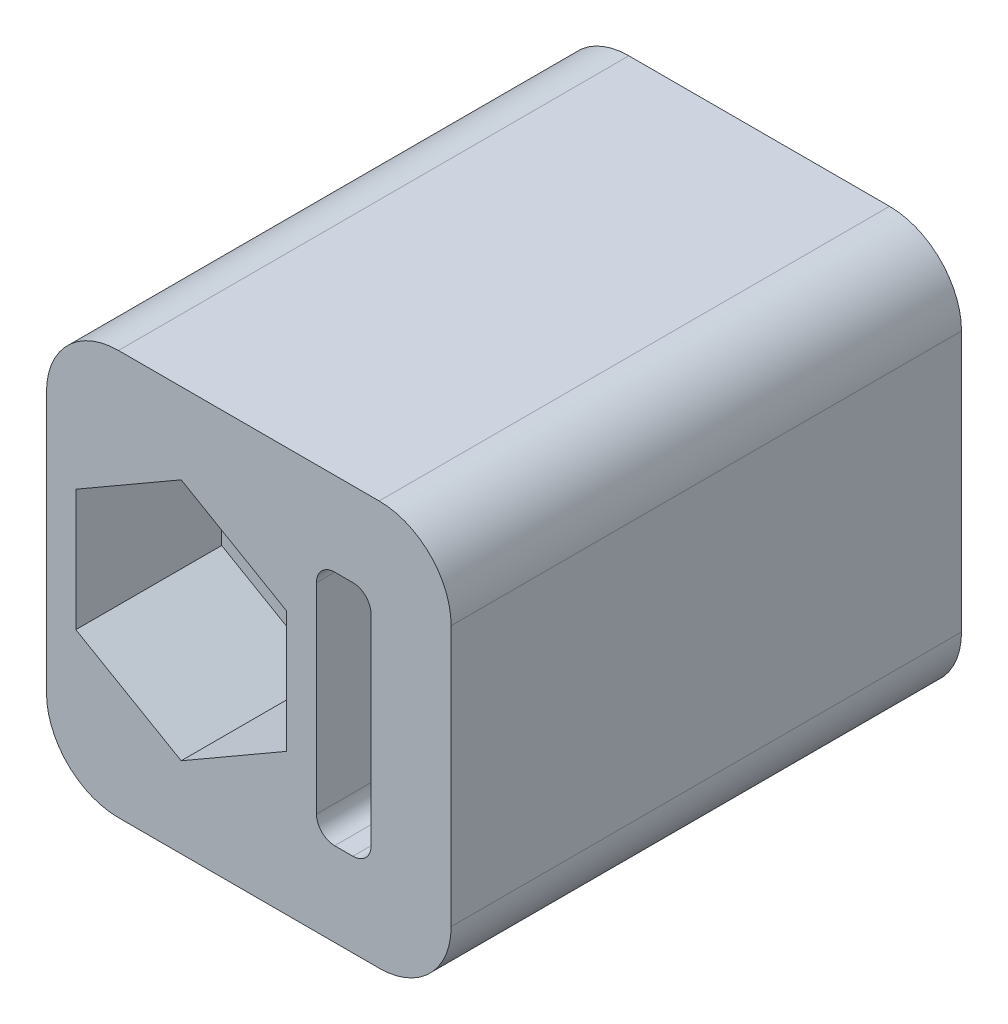
ISO-10303-21;
HEADER;
FILE_DESCRIPTION(('STEP AP214'),'2;1');
FILE_NAME('part.step','',(''),(''),'','','');
FILE_SCHEMA(('AUTOMOTIVE_DESIGN { 1 0 10303 214 1 1 1 1 }'));
ENDSEC;
DATA;
#1=APPLICATION_CONTEXT('core data for automotive mechanical design processes');
#2=APPLICATION_PROTOCOL_DEFINITION('international standard','automotive_design',2000,#1);
#3=PRODUCT_CONTEXT('',#1,'mechanical');
#4=PRODUCT('Part','Part','',(#3));
#5=PRODUCT_RELATED_PRODUCT_CATEGORY('part','',(#4));
#6=PRODUCT_DEFINITION_FORMATION('','',#4);
#7=PRODUCT_DEFINITION_CONTEXT('part definition',#1,'design');
#8=PRODUCT_DEFINITION('design','',#6,#7);
#9=PRODUCT_DEFINITION_SHAPE('','',#8);
#10=(LENGTH_UNIT() NAMED_UNIT(*) SI_UNIT(.MILLI.,.METRE.));
#11=(NAMED_UNIT(*) PLANE_ANGLE_UNIT() SI_UNIT($,.RADIAN.));
#12=(NAMED_UNIT(*) SI_UNIT($,.STERADIAN.) SOLID_ANGLE_UNIT());
#13=UNCERTAINTY_MEASURE_WITH_UNIT(LENGTH_MEASURE(1.E-05),#10,'distance_accuracy_value','');
#14=(GEOMETRIC_REPRESENTATION_CONTEXT(3) GLOBAL_UNCERTAINTY_ASSIGNED_CONTEXT((#13)) GLOBAL_UNIT_ASSIGNED_CONTEXT((#10,
#11,#12)) REPRESENTATION_CONTEXT('',''));
#15=CARTESIAN_POINT('',(0.,0.,0.));
#16=DIRECTION('',(0.,0.,1.));
#17=DIRECTION('',(1.,0.,0.));
#18=AXIS2_PLACEMENT_3D('',#15,#16,#17);
#19=CARTESIAN_POINT('',(-1.7200000000011,-3.5749999999999,0.));
#20=DIRECTION('',(0.,0.,1.));
#21=DIRECTION('',(1.,0.,0.));
#22=AXIS2_PLACEMENT_3D('',#19,#20,#21);
#23=PLANE('',#22);
#24=CARTESIAN_POINT('',(0.,0.,0.));
#25=DIRECTION('',(0.,0.,1.));
#26=DIRECTION('',(1.,0.,0.));
#27=AXIS2_PLACEMENT_3D('',#24,#25,#26);
#28=CIRCLE('',#27,1.70000000000001);
#29=CARTESIAN_POINT('',(1.70000000000001,0.,0.));
#30=VERTEX_POINT('',#29);
#31=EDGE_CURVE('E306',#30,#30,#28,.T.);
#32=ORIENTED_EDGE('',*,*,#31,.T.);
#33=EDGE_LOOP('',(#32));
#34=FACE_BOUND('',#33,.T.);
#35=CARTESIAN_POINT('',(-1.7200000000011,-3.5749999999999,0.));
#36=DIRECTION('',(0.,0.,1.));
#37=DIRECTION('',(1.,0.,0.));
#38=AXIS2_PLACEMENT_3D('',#35,#36,#37);
#39=CIRCLE('',#38,1.975);
#40=CARTESIAN_POINT('',(-3.6950000000011,-3.5749999999999,0.));
#41=VERTEX_POINT('',#40);
#42=CARTESIAN_POINT('',(-1.7200000000011,-5.5499999999999,0.));
#43=VERTEX_POINT('',#42);
#44=EDGE_CURVE('E358',#41,#43,#39,.T.);
#45=ORIENTED_EDGE('',*,*,#44,.F.);
#46=DIRECTION('',(0.,-1.,0.));
#47=VECTOR('',#46,1.);
#48=CARTESIAN_POINT('',(-3.6950000000011,-3.5749999999999,0.));
#49=LINE('',#48,#47);
#50=CARTESIAN_POINT('',(-3.6950000000011,3.5750000000001,0.));
#51=VERTEX_POINT('',#50);
#52=EDGE_CURVE('E363',#51,#41,#49,.T.);
#53=ORIENTED_EDGE('',*,*,#52,.F.);
#54=CARTESIAN_POINT('',(-1.7200000000011,3.5750000000001,0.));
#55=DIRECTION('',(0.,0.,1.));
#56=DIRECTION('',(1.,0.,0.));
#57=AXIS2_PLACEMENT_3D('',#54,#55,#56);
#58=CIRCLE('',#57,1.975);
#59=CARTESIAN_POINT('',(-1.7200000000011,5.5500000000001,0.));
#60=VERTEX_POINT('',#59);
#61=EDGE_CURVE('E390',#60,#51,#58,.T.);
#62=ORIENTED_EDGE('',*,*,#61,.F.);
#63=DIRECTION('',(-1.,0.,0.));
#64=VECTOR('',#63,1.);
#65=CARTESIAN_POINT('',(5.4299999999989,5.5500000000001,0.));
#66=LINE('',#65,#64);
#67=CARTESIAN_POINT('',(5.4299999999989,5.5500000000001,0.));
#68=VERTEX_POINT('',#67);
#69=EDGE_CURVE('E388',#68,#60,#66,.T.);
#70=ORIENTED_EDGE('',*,*,#69,.F.);
#71=CARTESIAN_POINT('',(5.4299999999989,3.5750000000001,0.));
#72=DIRECTION('',(0.,0.,1.));
#73=DIRECTION('',(1.,0.,0.));
#74=AXIS2_PLACEMENT_3D('',#71,#72,#73);
#75=CIRCLE('',#74,1.975);
#76=CARTESIAN_POINT('',(7.4049999999989,3.5750000000001,0.));
#77=VERTEX_POINT('',#76);
#78=EDGE_CURVE('E386',#77,#68,#75,.T.);
#79=ORIENTED_EDGE('',*,*,#78,.F.);
#80=DIRECTION('',(0.,1.,0.));
#81=VECTOR('',#80,1.);
#82=CARTESIAN_POINT('',(7.4049999999989,-3.5749999999999,0.));
#83=LINE('',#82,#81);
#84=CARTESIAN_POINT('',(7.4049999999989,-3.5749999999999,0.));
#85=VERTEX_POINT('',#84);
#86=EDGE_CURVE('E384',#85,#77,#83,.T.);
#87=ORIENTED_EDGE('',*,*,#86,.F.);
#88=CARTESIAN_POINT('',(5.4299999999989,-3.5749999999999,0.));
#89=DIRECTION('',(0.,0.,1.));
#90=DIRECTION('',(1.,0.,0.));
#91=AXIS2_PLACEMENT_3D('',#88,#89,#90);
#92=CIRCLE('',#91,1.975);
#93=CARTESIAN_POINT('',(5.4299999999989,-5.5499999999999,0.));
#94=VERTEX_POINT('',#93);
#95=EDGE_CURVE('E382',#94,#85,#92,.T.);
#96=ORIENTED_EDGE('',*,*,#95,.F.);
#97=DIRECTION('',(1.,0.,0.));
#98=VECTOR('',#97,1.);
#99=CARTESIAN_POINT('',(5.4299999999989,-5.5499999999999,0.));
#100=LINE('',#99,#98);
#101=EDGE_CURVE('E380',#43,#94,#100,.T.);
#102=ORIENTED_EDGE('',*,*,#101,.F.);
#103=EDGE_LOOP('',(#45,#53,#62,#70,#79,#87,#96,#102));
#104=FACE_BOUND('',#103,.T.);
#105=DIRECTION('',(1.,0.,0.));
#106=VECTOR('',#105,1.);
#107=CARTESIAN_POINT('',(4.21000000000005,-3.25000000000034,0.));
#108=LINE('',#107,#106);
#109=CARTESIAN_POINT('',(4.21000000000005,-3.25000000000034,0.));
#110=VERTEX_POINT('',#109);
#111=CARTESIAN_POINT('',(5.51000000000004,-3.25000000000034,0.));
#112=VERTEX_POINT('',#111);
#113=EDGE_CURVE('E313',#110,#112,#108,.T.);
#114=ORIENTED_EDGE('',*,*,#113,.T.);
#115=CARTESIAN_POINT('',(5.51000000000004,-2.75000000000034,0.));
#116=DIRECTION('',(0.,0.,1.));
#117=DIRECTION('',(1.,0.,0.));
#118=AXIS2_PLACEMENT_3D('',#115,#116,#117);
#119=CIRCLE('',#118,0.500000000000007);
#120=CARTESIAN_POINT('',(6.01000000000005,-2.75000000000034,0.));
#121=VERTEX_POINT('',#120);
#122=EDGE_CURVE('E228',#112,#121,#119,.T.);
#123=ORIENTED_EDGE('',*,*,#122,.T.);
#124=DIRECTION('',(0.,1.,0.));
#125=VECTOR('',#124,1.);
#126=CARTESIAN_POINT('',(6.01000000000006,2.74999999999966,0.));
#127=LINE('',#126,#125);
#128=CARTESIAN_POINT('',(6.01000000000006,2.74999999999966,0.));
#129=VERTEX_POINT('',#128);
#130=EDGE_CURVE('E246',#121,#129,#127,.T.);
#131=ORIENTED_EDGE('',*,*,#130,.T.);
#132=CARTESIAN_POINT('',(5.51000000000004,2.74999999999966,0.));
#133=DIRECTION('',(0.,0.,1.));
#134=DIRECTION('',(1.,0.,0.));
#135=AXIS2_PLACEMENT_3D('',#132,#133,#134);
#136=CIRCLE('',#135,0.500000000000011);
#137=CARTESIAN_POINT('',(5.51000000000004,3.24999999999967,0.));
#138=VERTEX_POINT('',#137);
#139=EDGE_CURVE('E222',#129,#138,#136,.T.);
#140=ORIENTED_EDGE('',*,*,#139,.T.);
#141=DIRECTION('',(-1.,0.,0.));
#142=VECTOR('',#141,1.);
#143=CARTESIAN_POINT('',(4.21000000000005,3.24999999999966,0.));
#144=LINE('',#143,#142);
#145=CARTESIAN_POINT('',(4.21000000000005,3.24999999999966,0.));
#146=VERTEX_POINT('',#145);
#147=EDGE_CURVE('E309',#138,#146,#144,.T.);
#148=ORIENTED_EDGE('',*,*,#147,.T.);
#149=CARTESIAN_POINT('',(4.21000000000005,2.74999999999966,0.));
#150=DIRECTION('',(0.,0.,1.));
#151=DIRECTION('',(-1.,0.,0.));
#152=AXIS2_PLACEMENT_3D('',#149,#150,#151);
#153=CIRCLE('',#152,0.5);
#154=CARTESIAN_POINT('',(3.71000000000004,2.74999999999966,0.));
#155=VERTEX_POINT('',#154);
#156=EDGE_CURVE('E330',#146,#155,#153,.T.);
#157=ORIENTED_EDGE('',*,*,#156,.T.);
#158=DIRECTION('',(0.,-1.,0.));
#159=VECTOR('',#158,1.);
#160=CARTESIAN_POINT('',(3.71000000000004,2.74999999999966,0.));
#161=LINE('',#160,#159);
#162=CARTESIAN_POINT('',(3.71000000000004,-2.75000000000034,0.));
#163=VERTEX_POINT('',#162);
#164=EDGE_CURVE('E333',#155,#163,#161,.T.);
#165=ORIENTED_EDGE('',*,*,#164,.T.);
#166=CARTESIAN_POINT('',(4.21000000000005,-2.75000000000034,0.));
#167=DIRECTION('',(0.,0.,1.));
#168=DIRECTION('',(1.,0.,0.));
#169=AXIS2_PLACEMENT_3D('',#166,#167,#168);
#170=CIRCLE('',#169,0.5);
#171=EDGE_CURVE('E336',#163,#110,#170,.T.);
#172=ORIENTED_EDGE('',*,*,#171,.T.);
#173=EDGE_LOOP('',(#114,#123,#131,#140,#148,#157,#165,#172));
#174=FACE_BOUND('',#173,.T.);
#175=ADVANCED_FACE('F37',(#34,#104,#174),#23,.F.);
#176=CARTESIAN_POINT('',(0.,0.,14.));
#177=DIRECTION('',(0.,0.,-1.));
#178=DIRECTION('',(-1.,0.,0.));
#179=AXIS2_PLACEMENT_3D('',#176,#177,#178);
#180=CYLINDRICAL_SURFACE('',#179,1.70000000000001);
#181=ORIENTED_EDGE('',*,*,#31,.F.);
#182=EDGE_LOOP('',(#181));
#183=FACE_BOUND('',#182,.T.);
#184=CARTESIAN_POINT('',(0.,0.,10.));
#185=DIRECTION('',(0.,0.,1.));
#186=DIRECTION('',(1.,0.,0.));
#187=AXIS2_PLACEMENT_3D('',#184,#185,#186);
#188=CIRCLE('',#187,1.70000000000001);
#189=CARTESIAN_POINT('',(1.70000000000001,0.,10.));
#190=VERTEX_POINT('',#189);
#191=EDGE_CURVE('E41',#190,#190,#188,.T.);
#192=ORIENTED_EDGE('',*,*,#191,.T.);
#193=EDGE_LOOP('',(#192));
#194=FACE_BOUND('',#193,.T.);
#195=ADVANCED_FACE('F461',(#183,#194),#180,.F.);
#196=CARTESIAN_POINT('',(-1.7200000000011,-3.5749999999999,14.));
#197=DIRECTION('',(0.,0.,1.));
#198=DIRECTION('',(1.,0.,0.));
#199=AXIS2_PLACEMENT_3D('',#196,#197,#198);
#200=PLANE('',#199);
#201=DIRECTION('',(-0.866025403784439,0.5,0.));
#202=VECTOR('',#201,1.);
#203=CARTESIAN_POINT('',(2.89,1.66854227795802,14.));
#204=LINE('',#203,#202);
#205=CARTESIAN_POINT('',(2.89,1.66854227795802,14.));
#206=VERTEX_POINT('',#205);
#207=CARTESIAN_POINT('',(0.,3.33708455591604,14.));
#208=VERTEX_POINT('',#207);
#209=EDGE_CURVE('E61',#206,#208,#204,.T.);
#210=ORIENTED_EDGE('',*,*,#209,.F.);
#211=DIRECTION('',(0.,1.,0.));
#212=VECTOR('',#211,1.);
#213=CARTESIAN_POINT('',(2.89,-1.66854227795802,14.));
#214=LINE('',#213,#212);
#215=CARTESIAN_POINT('',(2.89,-1.66854227795802,14.));
#216=VERTEX_POINT('',#215);
#217=EDGE_CURVE('E264',#216,#206,#214,.T.);
#218=ORIENTED_EDGE('',*,*,#217,.F.);
#219=DIRECTION('',(0.866025403784439,0.5,0.));
#220=VECTOR('',#219,1.);
#221=CARTESIAN_POINT('',(0.,-3.33708455591604,14.));
#222=LINE('',#221,#220);
#223=CARTESIAN_POINT('',(0.,-3.33708455591604,14.));
#224=VERTEX_POINT('',#223);
#225=EDGE_CURVE('E290',#224,#216,#222,.T.);
#226=ORIENTED_EDGE('',*,*,#225,.F.);
#227=DIRECTION('',(0.866025403784438,-0.5,0.));
#228=VECTOR('',#227,1.);
#229=CARTESIAN_POINT('',(-2.89,-1.66854227795802,14.));
#230=LINE('',#229,#228);
#231=CARTESIAN_POINT('',(-2.89,-1.66854227795802,14.));
#232=VERTEX_POINT('',#231);
#233=EDGE_CURVE('E287',#232,#224,#230,.T.);
#234=ORIENTED_EDGE('',*,*,#233,.F.);
#235=DIRECTION('',(0.,-1.,0.));
#236=VECTOR('',#235,1.);
#237=CARTESIAN_POINT('',(-2.89,1.66854227795802,14.));
#238=LINE('',#237,#236);
#239=CARTESIAN_POINT('',(-2.89,1.66854227795802,14.));
#240=VERTEX_POINT('',#239);
#241=EDGE_CURVE('E284',#240,#232,#238,.T.);
#242=ORIENTED_EDGE('',*,*,#241,.F.);
#243=DIRECTION('',(-0.866025403784439,-0.5,0.));
#244=VECTOR('',#243,1.);
#245=CARTESIAN_POINT('',(0.,3.33708455591604,14.));
#246=LINE('',#245,#244);
#247=EDGE_CURVE('E281',#208,#240,#246,.T.);
#248=ORIENTED_EDGE('',*,*,#247,.F.);
#249=EDGE_LOOP('',(#210,#218,#226,#234,#242,#248));
#250=FACE_BOUND('',#249,.T.);
#251=DIRECTION('',(0.,1.,0.));
#252=VECTOR('',#251,1.);
#253=CARTESIAN_POINT('',(5.2099999999998,2.74999999999904,14.));
#254=LINE('',#253,#252);
#255=CARTESIAN_POINT('',(5.2099999999998,-2.75000000000096,14.));
#256=VERTEX_POINT('',#255);
#257=CARTESIAN_POINT('',(5.2099999999998,2.74999999999904,14.));
#258=VERTEX_POINT('',#257);
#259=EDGE_CURVE('E312',#256,#258,#254,.T.);
#260=ORIENTED_EDGE('',*,*,#259,.F.);
#261=CARTESIAN_POINT('',(4.7099999999998,-2.75000000000034,14.));
#262=DIRECTION('',(0.,0.,1.));
#263=DIRECTION('',(-1.,0.,0.));
#264=AXIS2_PLACEMENT_3D('',#261,#262,#263);
#265=CIRCLE('',#264,0.5);
#266=CARTESIAN_POINT('',(4.71000000000005,-3.25000000000034,14.));
#267=VERTEX_POINT('',#266);
#268=EDGE_CURVE('E310',#267,#256,#265,.T.);
#269=ORIENTED_EDGE('',*,*,#268,.F.);
#270=DIRECTION('',(1.,0.,0.));
#271=VECTOR('',#270,1.);
#272=CARTESIAN_POINT('',(4.21000000000005,-3.25000000000034,14.));
#273=LINE('',#272,#271);
#274=CARTESIAN_POINT('',(4.21000000000005,-3.25000000000034,14.));
#275=VERTEX_POINT('',#274);
#276=EDGE_CURVE('E326',#275,#267,#273,.T.);
#277=ORIENTED_EDGE('',*,*,#276,.F.);
#278=CARTESIAN_POINT('',(4.21000000000005,-2.75000000000034,14.));
#279=DIRECTION('',(0.,0.,1.));
#280=DIRECTION('',(1.,0.,0.));
#281=AXIS2_PLACEMENT_3D('',#278,#279,#280);
#282=CIRCLE('',#281,0.5);
#283=CARTESIAN_POINT('',(3.71000000000004,-2.75000000000034,14.));
#284=VERTEX_POINT('',#283);
#285=EDGE_CURVE('E323',#284,#275,#282,.T.);
#286=ORIENTED_EDGE('',*,*,#285,.F.);
#287=DIRECTION('',(0.,-1.,0.));
#288=VECTOR('',#287,1.);
#289=CARTESIAN_POINT('',(3.71000000000004,2.74999999999966,14.));
#290=LINE('',#289,#288);
#291=CARTESIAN_POINT('',(3.71000000000004,2.74999999999966,14.));
#292=VERTEX_POINT('',#291);
#293=EDGE_CURVE('E321',#292,#284,#290,.T.);
#294=ORIENTED_EDGE('',*,*,#293,.F.);
#295=CARTESIAN_POINT('',(4.21000000000005,2.74999999999966,14.));
#296=DIRECTION('',(0.,0.,1.));
#297=DIRECTION('',(-1.,0.,0.));
#298=AXIS2_PLACEMENT_3D('',#295,#296,#297);
#299=CIRCLE('',#298,0.5);
#300=CARTESIAN_POINT('',(4.21000000000005,3.24999999999966,14.));
#301=VERTEX_POINT('',#300);
#302=EDGE_CURVE('E319',#301,#292,#299,.T.);
#303=ORIENTED_EDGE('',*,*,#302,.F.);
#304=DIRECTION('',(-1.,0.,0.));
#305=VECTOR('',#304,1.);
#306=CARTESIAN_POINT('',(4.21000000000005,3.24999999999966,14.));
#307=LINE('',#306,#305);
#308=CARTESIAN_POINT('',(4.71000000000005,3.24999999999966,14.));
#309=VERTEX_POINT('',#308);
#310=EDGE_CURVE('E317',#309,#301,#307,.T.);
#311=ORIENTED_EDGE('',*,*,#310,.F.);
#312=CARTESIAN_POINT('',(4.7099999999998,2.74999999999966,14.));
#313=DIRECTION('',(0.,0.,1.));
#314=DIRECTION('',(-1.,0.,0.));
#315=AXIS2_PLACEMENT_3D('',#312,#313,#314);
#316=CIRCLE('',#315,0.499999999999999);
#317=EDGE_CURVE('E315',#258,#309,#316,.T.);
#318=ORIENTED_EDGE('',*,*,#317,.F.);
#319=EDGE_LOOP('',(#260,#269,#277,#286,#294,#303,#311,#318));
#320=FACE_BOUND('',#319,.T.);
#321=CARTESIAN_POINT('',(-1.7200000000011,-3.5749999999999,14.));
#322=DIRECTION('',(0.,0.,1.));
#323=DIRECTION('',(1.,0.,0.));
#324=AXIS2_PLACEMENT_3D('',#321,#322,#323);
#325=CIRCLE('',#324,1.975);
#326=CARTESIAN_POINT('',(-3.6950000000011,-3.5749999999999,14.));
#327=VERTEX_POINT('',#326);
#328=CARTESIAN_POINT('',(-1.7200000000011,-5.5499999999999,14.));
#329=VERTEX_POINT('',#328);
#330=EDGE_CURVE('E359',#327,#329,#325,.T.);
#331=ORIENTED_EDGE('',*,*,#330,.T.);
#332=DIRECTION('',(1.,0.,0.));
#333=VECTOR('',#332,1.);
#334=CARTESIAN_POINT('',(5.4299999999989,-5.5499999999999,14.));
#335=LINE('',#334,#333);
#336=CARTESIAN_POINT('',(5.4299999999989,-5.5499999999999,14.));
#337=VERTEX_POINT('',#336);
#338=EDGE_CURVE('E362',#329,#337,#335,.T.);
#339=ORIENTED_EDGE('',*,*,#338,.T.);
#340=CARTESIAN_POINT('',(5.4299999999989,-3.5749999999999,14.));
#341=DIRECTION('',(0.,0.,1.));
#342=DIRECTION('',(1.,0.,0.));
#343=AXIS2_PLACEMENT_3D('',#340,#341,#342);
#344=CIRCLE('',#343,1.975);
#345=CARTESIAN_POINT('',(7.4049999999989,-3.5749999999999,14.));
#346=VERTEX_POINT('',#345);
#347=EDGE_CURVE('E365',#337,#346,#344,.T.);
#348=ORIENTED_EDGE('',*,*,#347,.T.);
#349=DIRECTION('',(0.,1.,0.));
#350=VECTOR('',#349,1.);
#351=CARTESIAN_POINT('',(7.4049999999989,-3.5749999999999,14.));
#352=LINE('',#351,#350);
#353=CARTESIAN_POINT('',(7.4049999999989,3.5750000000001,14.));
#354=VERTEX_POINT('',#353);
#355=EDGE_CURVE('E367',#346,#354,#352,.T.);
#356=ORIENTED_EDGE('',*,*,#355,.T.);
#357=CARTESIAN_POINT('',(5.4299999999989,3.5750000000001,14.));
#358=DIRECTION('',(0.,0.,1.));
#359=DIRECTION('',(1.,0.,0.));
#360=AXIS2_PLACEMENT_3D('',#357,#358,#359);
#361=CIRCLE('',#360,1.975);
#362=CARTESIAN_POINT('',(5.4299999999989,5.5500000000001,14.));
#363=VERTEX_POINT('',#362);
#364=EDGE_CURVE('E369',#354,#363,#361,.T.);
#365=ORIENTED_EDGE('',*,*,#364,.T.);
#366=DIRECTION('',(-1.,0.,0.));
#367=VECTOR('',#366,1.);
#368=CARTESIAN_POINT('',(5.4299999999989,5.5500000000001,14.));
#369=LINE('',#368,#367);
#370=CARTESIAN_POINT('',(-1.7200000000011,5.5500000000001,14.));
#371=VERTEX_POINT('',#370);
#372=EDGE_CURVE('E371',#363,#371,#369,.T.);
#373=ORIENTED_EDGE('',*,*,#372,.T.);
#374=CARTESIAN_POINT('',(-1.7200000000011,3.5750000000001,14.));
#375=DIRECTION('',(0.,0.,1.));
#376=DIRECTION('',(1.,0.,0.));
#377=AXIS2_PLACEMENT_3D('',#374,#375,#376);
#378=CIRCLE('',#377,1.975);
#379=CARTESIAN_POINT('',(-3.6950000000011,3.5750000000001,14.));
#380=VERTEX_POINT('',#379);
#381=EDGE_CURVE('E373',#371,#380,#378,.T.);
#382=ORIENTED_EDGE('',*,*,#381,.T.);
#383=DIRECTION('',(0.,-1.,0.));
#384=VECTOR('',#383,1.);
#385=CARTESIAN_POINT('',(-3.6950000000011,-3.5749999999999,14.));
#386=LINE('',#385,#384);
#387=EDGE_CURVE('E375',#380,#327,#386,.T.);
#388=ORIENTED_EDGE('',*,*,#387,.T.);
#389=EDGE_LOOP('',(#331,#339,#348,#356,#365,#373,#382,#388));
#390=FACE_BOUND('',#389,.T.);
#391=ADVANCED_FACE('F434',(#250,#320,#390),#200,.T.);
#392=CARTESIAN_POINT('',(-1.7200000000011,-3.5749999999999,14.));
#393=DIRECTION('',(0.,0.,-1.));
#394=DIRECTION('',(-1.,0.,0.));
#395=AXIS2_PLACEMENT_3D('',#392,#393,#394);
#396=CYLINDRICAL_SURFACE('',#395,1.975);
#397=ORIENTED_EDGE('',*,*,#44,.T.);
#398=DIRECTION('',(0.,0.,-1.));
#399=VECTOR('',#398,1.);
#400=CARTESIAN_POINT('',(-1.7200000000011,-5.5499999999999,14.));
#401=LINE('',#400,#399);
#402=EDGE_CURVE('E11',#329,#43,#401,.T.);
#403=ORIENTED_EDGE('',*,*,#402,.F.);
#404=ORIENTED_EDGE('',*,*,#330,.F.);
#405=DIRECTION('',(0.,0.,-1.));
#406=VECTOR('',#405,1.);
#407=CARTESIAN_POINT('',(-3.6950000000011,-3.5749999999999,14.));
#408=LINE('',#407,#406);
#409=EDGE_CURVE('E377',#327,#41,#408,.T.);
#410=ORIENTED_EDGE('',*,*,#409,.T.);
#411=EDGE_LOOP('',(#397,#403,#404,#410));
#412=FACE_BOUND('',#411,.T.);
#413=ADVANCED_FACE('F39',(#412),#396,.T.);
#414=CARTESIAN_POINT('',(5.4299999999989,-5.5499999999999,14.));
#415=DIRECTION('',(0.,1.,0.));
#416=DIRECTION('',(0.,0.,1.));
#417=AXIS2_PLACEMENT_3D('',#414,#415,#416);
#418=PLANE('',#417);
#419=ORIENTED_EDGE('',*,*,#101,.T.);
#420=DIRECTION('',(0.,0.,-1.));
#421=VECTOR('',#420,1.);
#422=CARTESIAN_POINT('',(5.4299999999989,-5.5499999999999,14.));
#423=LINE('',#422,#421);
#424=EDGE_CURVE('E46',#337,#94,#423,.T.);
#425=ORIENTED_EDGE('',*,*,#424,.F.);
#426=ORIENTED_EDGE('',*,*,#338,.F.);
#427=ORIENTED_EDGE('',*,*,#402,.T.);
#428=EDGE_LOOP('',(#419,#425,#426,#427));
#429=FACE_BOUND('',#428,.T.);
#430=ADVANCED_FACE('F438',(#429),#418,.F.);
#431=CARTESIAN_POINT('',(5.4299999999989,-3.5749999999999,14.));
#432=DIRECTION('',(0.,0.,-1.));
#433=DIRECTION('',(-1.,0.,0.));
#434=AXIS2_PLACEMENT_3D('',#431,#432,#433);
#435=CYLINDRICAL_SURFACE('',#434,1.975);
#436=ORIENTED_EDGE('',*,*,#95,.T.);
#437=DIRECTION('',(0.,0.,-1.));
#438=VECTOR('',#437,1.);
#439=CARTESIAN_POINT('',(7.4049999999989,-3.5749999999999,14.));
#440=LINE('',#439,#438);
#441=EDGE_CURVE('E407',#346,#85,#440,.T.);
#442=ORIENTED_EDGE('',*,*,#441,.F.);
#443=ORIENTED_EDGE('',*,*,#347,.F.);
#444=ORIENTED_EDGE('',*,*,#424,.T.);
#445=EDGE_LOOP('',(#436,#442,#443,#444));
#446=FACE_BOUND('',#445,.T.);
#447=ADVANCED_FACE('F415',(#446),#435,.T.);
#448=CARTESIAN_POINT('',(7.4049999999989,-3.5749999999999,14.));
#449=DIRECTION('',(-1.,0.,0.));
#450=DIRECTION('',(0.,0.,1.));
#451=AXIS2_PLACEMENT_3D('',#448,#449,#450);
#452=PLANE('',#451);
#453=ORIENTED_EDGE('',*,*,#86,.T.);
#454=DIRECTION('',(0.,0.,-1.));
#455=VECTOR('',#454,1.);
#456=CARTESIAN_POINT('',(7.4049999999989,3.5750000000001,14.));
#457=LINE('',#456,#455);
#458=EDGE_CURVE('E404',#354,#77,#457,.T.);
#459=ORIENTED_EDGE('',*,*,#458,.F.);
#460=ORIENTED_EDGE('',*,*,#355,.F.);
#461=ORIENTED_EDGE('',*,*,#441,.T.);
#462=EDGE_LOOP('',(#453,#459,#460,#461));
#463=FACE_BOUND('',#462,.T.);
#464=ADVANCED_FACE('F426',(#463),#452,.F.);
#465=CARTESIAN_POINT('',(5.4299999999989,3.5750000000001,14.));
#466=DIRECTION('',(0.,0.,-1.));
#467=DIRECTION('',(-1.,0.,0.));
#468=AXIS2_PLACEMENT_3D('',#465,#466,#467);
#469=CYLINDRICAL_SURFACE('',#468,1.975);
#470=ORIENTED_EDGE('',*,*,#78,.T.);
#471=DIRECTION('',(0.,0.,-1.));
#472=VECTOR('',#471,1.);
#473=CARTESIAN_POINT('',(5.4299999999989,5.5500000000001,14.));
#474=LINE('',#473,#472);
#475=EDGE_CURVE('E401',#363,#68,#474,.T.);
#476=ORIENTED_EDGE('',*,*,#475,.F.);
#477=ORIENTED_EDGE('',*,*,#364,.F.);
#478=ORIENTED_EDGE('',*,*,#458,.T.);
#479=EDGE_LOOP('',(#470,#476,#477,#478));
#480=FACE_BOUND('',#479,.T.);
#481=ADVANCED_FACE('F430',(#480),#469,.T.);
#482=CARTESIAN_POINT('',(5.4299999999989,5.5500000000001,14.));
#483=DIRECTION('',(0.,-1.,0.));
#484=DIRECTION('',(0.,0.,-1.));
#485=AXIS2_PLACEMENT_3D('',#482,#483,#484);
#486=PLANE('',#485);
#487=ORIENTED_EDGE('',*,*,#69,.T.);
#488=DIRECTION('',(0.,0.,-1.));
#489=VECTOR('',#488,1.);
#490=CARTESIAN_POINT('',(-1.7200000000011,5.5500000000001,14.));
#491=LINE('',#490,#489);
#492=EDGE_CURVE('E398',#371,#60,#491,.T.);
#493=ORIENTED_EDGE('',*,*,#492,.F.);
#494=ORIENTED_EDGE('',*,*,#372,.F.);
#495=ORIENTED_EDGE('',*,*,#475,.T.);
#496=EDGE_LOOP('',(#487,#493,#494,#495));
#497=FACE_BOUND('',#496,.T.);
#498=ADVANCED_FACE('F451',(#497),#486,.F.);
#499=CARTESIAN_POINT('',(-1.7200000000011,3.5750000000001,14.));
#500=DIRECTION('',(0.,0.,-1.));
#501=DIRECTION('',(-1.,0.,0.));
#502=AXIS2_PLACEMENT_3D('',#499,#500,#501);
#503=CYLINDRICAL_SURFACE('',#502,1.975);
#504=ORIENTED_EDGE('',*,*,#61,.T.);
#505=DIRECTION('',(0.,0.,-1.));
#506=VECTOR('',#505,1.);
#507=CARTESIAN_POINT('',(-3.6950000000011,3.5750000000001,14.));
#508=LINE('',#507,#506);
#509=EDGE_CURVE('E395',#380,#51,#508,.T.);
#510=ORIENTED_EDGE('',*,*,#509,.F.);
#511=ORIENTED_EDGE('',*,*,#381,.F.);
#512=ORIENTED_EDGE('',*,*,#492,.T.);
#513=EDGE_LOOP('',(#504,#510,#511,#512));
#514=FACE_BOUND('',#513,.T.);
#515=ADVANCED_FACE('F449',(#514),#503,.T.);
#516=CARTESIAN_POINT('',(-3.6950000000011,-3.5749999999999,14.));
#517=DIRECTION('',(1.,0.,0.));
#518=DIRECTION('',(0.,0.,-1.));
#519=AXIS2_PLACEMENT_3D('',#516,#517,#518);
#520=PLANE('',#519);
#521=ORIENTED_EDGE('',*,*,#52,.T.);
#522=ORIENTED_EDGE('',*,*,#409,.F.);
#523=ORIENTED_EDGE('',*,*,#387,.F.);
#524=ORIENTED_EDGE('',*,*,#509,.T.);
#525=EDGE_LOOP('',(#521,#522,#523,#524));
#526=FACE_BOUND('',#525,.T.);
#527=ADVANCED_FACE('F444',(#526),#520,.F.);
#528=CARTESIAN_POINT('',(4.7099999999998,-2.75000000000034,14.));
#529=DIRECTION('',(0.,0.,-1.));
#530=DIRECTION('',(-1.,0.,0.));
#531=AXIS2_PLACEMENT_3D('',#528,#529,#530);
#532=CYLINDRICAL_SURFACE('',#531,0.5);
#533=CARTESIAN_POINT('',(4.7099999999998,-2.75000000000034,7.));
#534=DIRECTION('',(0.,0.,1.));
#535=DIRECTION('',(1.,0.,0.));
#536=AXIS2_PLACEMENT_3D('',#533,#534,#535);
#537=CIRCLE('',#536,0.5);
#538=CARTESIAN_POINT('',(4.71000000000005,-3.25000000000034,7.));
#539=VERTEX_POINT('',#538);
#540=CARTESIAN_POINT('',(5.2099999999998,-2.75000000000096,7.));
#541=VERTEX_POINT('',#540);
#542=EDGE_CURVE('E258',#539,#541,#537,.T.);
#543=ORIENTED_EDGE('',*,*,#542,.F.);
#544=DIRECTION('',(0.,0.,-1.));
#545=VECTOR('',#544,1.);
#546=CARTESIAN_POINT('',(4.71000000000005,-3.25000000000034,14.));
#547=LINE('',#546,#545);
#548=EDGE_CURVE('E218',#267,#539,#547,.T.);
#549=ORIENTED_EDGE('',*,*,#548,.F.);
#550=ORIENTED_EDGE('',*,*,#268,.T.);
#551=DIRECTION('',(0.,0.,-1.));
#552=VECTOR('',#551,1.);
#553=CARTESIAN_POINT('',(5.2099999999998,-2.75000000000096,14.));
#554=LINE('',#553,#552);
#555=EDGE_CURVE('E355',#256,#541,#554,.T.);
#556=ORIENTED_EDGE('',*,*,#555,.T.);
#557=EDGE_LOOP('',(#543,#549,#550,#556));
#558=FACE_BOUND('',#557,.T.);
#559=ADVANCED_FACE('F473',(#558),#532,.F.);
#560=CARTESIAN_POINT('',(5.2099999999998,2.74999999999904,14.));
#561=DIRECTION('',(-1.,0.,0.));
#562=DIRECTION('',(0.,0.,1.));
#563=AXIS2_PLACEMENT_3D('',#560,#561,#562);
#564=PLANE('',#563);
#565=DIRECTION('',(0.,1.,0.));
#566=VECTOR('',#565,1.);
#567=CARTESIAN_POINT('',(5.2099999999998,2.74999999999904,7.));
#568=LINE('',#567,#566);
#569=CARTESIAN_POINT('',(5.2099999999998,2.74999999999904,7.));
#570=VERTEX_POINT('',#569);
#571=EDGE_CURVE('E53',#541,#570,#568,.T.);
#572=ORIENTED_EDGE('',*,*,#571,.F.);
#573=ORIENTED_EDGE('',*,*,#555,.F.);
#574=ORIENTED_EDGE('',*,*,#259,.T.);
#575=DIRECTION('',(0.,0.,-1.));
#576=VECTOR('',#575,1.);
#577=CARTESIAN_POINT('',(5.2099999999998,2.74999999999904,14.));
#578=LINE('',#577,#576);
#579=EDGE_CURVE('E352',#258,#570,#578,.T.);
#580=ORIENTED_EDGE('',*,*,#579,.T.);
#581=EDGE_LOOP('',(#572,#573,#574,#580));
#582=FACE_BOUND('',#581,.T.);
#583=ADVANCED_FACE('F477',(#582),#564,.T.);
#584=CARTESIAN_POINT('',(4.7099999999998,2.74999999999966,14.));
#585=DIRECTION('',(0.,0.,-1.));
#586=DIRECTION('',(-1.,0.,0.));
#587=AXIS2_PLACEMENT_3D('',#584,#585,#586);
#588=CYLINDRICAL_SURFACE('',#587,0.499999999999999);
#589=CARTESIAN_POINT('',(4.7099999999998,2.74999999999966,7.));
#590=DIRECTION('',(0.,0.,1.));
#591=DIRECTION('',(1.,0.,0.));
#592=AXIS2_PLACEMENT_3D('',#589,#590,#591);
#593=CIRCLE('',#592,0.499999999999999);
#594=CARTESIAN_POINT('',(4.71000000000005,3.24999999999966,7.));
#595=VERTEX_POINT('',#594);
#596=EDGE_CURVE('E229',#570,#595,#593,.T.);
#597=ORIENTED_EDGE('',*,*,#596,.F.);
#598=ORIENTED_EDGE('',*,*,#579,.F.);
#599=ORIENTED_EDGE('',*,*,#317,.T.);
#600=DIRECTION('',(0.,0.,-1.));
#601=VECTOR('',#600,1.);
#602=CARTESIAN_POINT('',(4.71000000000005,3.24999999999966,14.));
#603=LINE('',#602,#601);
#604=EDGE_CURVE('E349',#309,#595,#603,.T.);
#605=ORIENTED_EDGE('',*,*,#604,.T.);
#606=EDGE_LOOP('',(#597,#598,#599,#605));
#607=FACE_BOUND('',#606,.T.);
#608=ADVANCED_FACE('F482',(#607),#588,.F.);
#609=CARTESIAN_POINT('',(4.21000000000005,3.24999999999966,14.));
#610=DIRECTION('',(0.,-1.,0.));
#611=DIRECTION('',(0.,0.,-1.));
#612=AXIS2_PLACEMENT_3D('',#609,#610,#611);
#613=PLANE('',#612);
#614=DIRECTION('',(0.,0.,-1.));
#615=VECTOR('',#614,1.);
#616=CARTESIAN_POINT('',(4.21000000000005,3.24999999999966,14.));
#617=LINE('',#616,#615);
#618=EDGE_CURVE('E347',#301,#146,#617,.T.);
#619=ORIENTED_EDGE('',*,*,#618,.T.);
#620=ORIENTED_EDGE('',*,*,#147,.F.);
#621=DIRECTION('',(0.,0.,-1.));
#622=VECTOR('',#621,1.);
#623=CARTESIAN_POINT('',(5.51000000000004,3.24999999999967,7.));
#624=LINE('',#623,#622);
#625=CARTESIAN_POINT('',(5.51000000000004,3.24999999999967,7.));
#626=VERTEX_POINT('',#625);
#627=EDGE_CURVE('E244',#626,#138,#624,.T.);
#628=ORIENTED_EDGE('',*,*,#627,.F.);
#629=DIRECTION('',(-1.,0.,0.));
#630=VECTOR('',#629,1.);
#631=CARTESIAN_POINT('',(4.21000000000005,3.24999999999966,7.));
#632=LINE('',#631,#630);
#633=EDGE_CURVE('E241',#626,#595,#632,.T.);
#634=ORIENTED_EDGE('',*,*,#633,.T.);
#635=ORIENTED_EDGE('',*,*,#604,.F.);
#636=ORIENTED_EDGE('',*,*,#310,.T.);
#637=EDGE_LOOP('',(#619,#620,#628,#634,#635,#636));
#638=FACE_BOUND('',#637,.T.);
#639=ADVANCED_FACE('F488',(#638),#613,.T.);
#640=CARTESIAN_POINT('',(4.21000000000005,2.74999999999966,14.));
#641=DIRECTION('',(0.,0.,-1.));
#642=DIRECTION('',(-1.,0.,0.));
#643=AXIS2_PLACEMENT_3D('',#640,#641,#642);
#644=CYLINDRICAL_SURFACE('',#643,0.5);
#645=DIRECTION('',(0.,0.,-1.));
#646=VECTOR('',#645,1.);
#647=CARTESIAN_POINT('',(3.71000000000004,2.74999999999966,14.));
#648=LINE('',#647,#646);
#649=EDGE_CURVE('E345',#292,#155,#648,.T.);
#650=ORIENTED_EDGE('',*,*,#649,.T.);
#651=ORIENTED_EDGE('',*,*,#156,.F.);
#652=ORIENTED_EDGE('',*,*,#618,.F.);
#653=ORIENTED_EDGE('',*,*,#302,.T.);
#654=EDGE_LOOP('',(#650,#651,#652,#653));
#655=FACE_BOUND('',#654,.T.);
#656=ADVANCED_FACE('F492',(#655),#644,.F.);
#657=CARTESIAN_POINT('',(3.71000000000004,2.74999999999966,14.));
#658=DIRECTION('',(1.,0.,0.));
#659=DIRECTION('',(0.,0.,-1.));
#660=AXIS2_PLACEMENT_3D('',#657,#658,#659);
#661=PLANE('',#660);
#662=DIRECTION('',(0.,0.,-1.));
#663=VECTOR('',#662,1.);
#664=CARTESIAN_POINT('',(3.71000000000004,-2.75000000000034,14.));
#665=LINE('',#664,#663);
#666=EDGE_CURVE('E343',#284,#163,#665,.T.);
#667=ORIENTED_EDGE('',*,*,#666,.T.);
#668=ORIENTED_EDGE('',*,*,#164,.F.);
#669=ORIENTED_EDGE('',*,*,#649,.F.);
#670=ORIENTED_EDGE('',*,*,#293,.T.);
#671=EDGE_LOOP('',(#667,#668,#669,#670));
#672=FACE_BOUND('',#671,.T.);
#673=ADVANCED_FACE('F496',(#672),#661,.T.);
#674=CARTESIAN_POINT('',(4.21000000000005,-2.75000000000034,14.));
#675=DIRECTION('',(0.,0.,-1.));
#676=DIRECTION('',(-1.,0.,0.));
#677=AXIS2_PLACEMENT_3D('',#674,#675,#676);
#678=CYLINDRICAL_SURFACE('',#677,0.5);
#679=DIRECTION('',(0.,0.,-1.));
#680=VECTOR('',#679,1.);
#681=CARTESIAN_POINT('',(4.21000000000005,-3.25000000000034,14.));
#682=LINE('',#681,#680);
#683=EDGE_CURVE('E341',#275,#110,#682,.T.);
#684=ORIENTED_EDGE('',*,*,#683,.T.);
#685=ORIENTED_EDGE('',*,*,#171,.F.);
#686=ORIENTED_EDGE('',*,*,#666,.F.);
#687=ORIENTED_EDGE('',*,*,#285,.T.);
#688=EDGE_LOOP('',(#684,#685,#686,#687));
#689=FACE_BOUND('',#688,.T.);
#690=ADVANCED_FACE('F500',(#689),#678,.F.);
#691=CARTESIAN_POINT('',(4.21000000000005,-3.25000000000034,14.));
#692=DIRECTION('',(0.,1.,0.));
#693=DIRECTION('',(0.,0.,1.));
#694=AXIS2_PLACEMENT_3D('',#691,#692,#693);
#695=PLANE('',#694);
#696=ORIENTED_EDGE('',*,*,#548,.T.);
#697=DIRECTION('',(1.,0.,0.));
#698=VECTOR('',#697,1.);
#699=CARTESIAN_POINT('',(5.51000000000004,-3.25000000000034,7.));
#700=LINE('',#699,#698);
#701=CARTESIAN_POINT('',(5.51000000000004,-3.25000000000034,7.));
#702=VERTEX_POINT('',#701);
#703=EDGE_CURVE('E211',#539,#702,#700,.T.);
#704=ORIENTED_EDGE('',*,*,#703,.T.);
#705=DIRECTION('',(0.,0.,-1.));
#706=VECTOR('',#705,1.);
#707=CARTESIAN_POINT('',(5.51000000000004,-3.25000000000034,7.));
#708=LINE('',#707,#706);
#709=EDGE_CURVE('E215',#702,#112,#708,.T.);
#710=ORIENTED_EDGE('',*,*,#709,.T.);
#711=ORIENTED_EDGE('',*,*,#113,.F.);
#712=ORIENTED_EDGE('',*,*,#683,.F.);
#713=ORIENTED_EDGE('',*,*,#276,.T.);
#714=EDGE_LOOP('',(#696,#704,#710,#711,#712,#713));
#715=FACE_BOUND('',#714,.T.);
#716=ADVANCED_FACE('F213',(#715),#695,.T.);
#717=CARTESIAN_POINT('',(2.89,1.66854227795802,10.));
#718=DIRECTION('',(0.5,0.866025403784438,0.));
#719=DIRECTION('',(-0.866025403784439,0.5,0.));
#720=AXIS2_PLACEMENT_3D('',#717,#718,#719);
#721=PLANE('',#720);
#722=ORIENTED_EDGE('',*,*,#209,.T.);
#723=DIRECTION('',(0.,0.,1.));
#724=VECTOR('',#723,1.);
#725=CARTESIAN_POINT('',(0.,3.33708455591604,10.));
#726=LINE('',#725,#724);
#727=CARTESIAN_POINT('',(0.,3.33708455591604,10.));
#728=VERTEX_POINT('',#727);
#729=EDGE_CURVE('E279',#728,#208,#726,.T.);
#730=ORIENTED_EDGE('',*,*,#729,.F.);
#731=DIRECTION('',(-0.866025403784439,0.5,0.));
#732=VECTOR('',#731,1.);
#733=CARTESIAN_POINT('',(2.89,1.66854227795802,10.));
#734=LINE('',#733,#732);
#735=CARTESIAN_POINT('',(2.89,1.66854227795802,10.));
#736=VERTEX_POINT('',#735);
#737=EDGE_CURVE('E260',#736,#728,#734,.T.);
#738=ORIENTED_EDGE('',*,*,#737,.F.);
#739=DIRECTION('',(0.,0.,1.));
#740=VECTOR('',#739,1.);
#741=CARTESIAN_POINT('',(2.89,1.66854227795802,10.));
#742=LINE('',#741,#740);
#743=EDGE_CURVE('E295',#736,#206,#742,.T.);
#744=ORIENTED_EDGE('',*,*,#743,.T.);
#745=EDGE_LOOP('',(#722,#730,#738,#744));
#746=FACE_BOUND('',#745,.T.);
#747=ADVANCED_FACE('F506',(#746),#721,.F.);
#748=CARTESIAN_POINT('',(2.89,-1.66854227795802,10.));
#749=DIRECTION('',(1.,0.,0.));
#750=DIRECTION('',(0.,0.,-1.));
#751=AXIS2_PLACEMENT_3D('',#748,#749,#750);
#752=PLANE('',#751);
#753=ORIENTED_EDGE('',*,*,#217,.T.);
#754=ORIENTED_EDGE('',*,*,#743,.F.);
#755=DIRECTION('',(0.,1.,0.));
#756=VECTOR('',#755,1.);
#757=CARTESIAN_POINT('',(2.89,-1.66854227795802,10.));
#758=LINE('',#757,#756);
#759=CARTESIAN_POINT('',(2.89,-1.66854227795802,10.));
#760=VERTEX_POINT('',#759);
#761=EDGE_CURVE('E276',#760,#736,#758,.T.);
#762=ORIENTED_EDGE('',*,*,#761,.F.);
#763=DIRECTION('',(0.,0.,1.));
#764=VECTOR('',#763,1.);
#765=CARTESIAN_POINT('',(2.89,-1.66854227795802,10.));
#766=LINE('',#765,#764);
#767=EDGE_CURVE('E297',#760,#216,#766,.T.);
#768=ORIENTED_EDGE('',*,*,#767,.T.);
#769=EDGE_LOOP('',(#753,#754,#762,#768));
#770=FACE_BOUND('',#769,.T.);
#771=ADVANCED_FACE('F510',(#770),#752,.F.);
#772=CARTESIAN_POINT('',(0.,-3.33708455591604,10.));
#773=DIRECTION('',(0.5,-0.866025403784439,0.));
#774=DIRECTION('',(0.866025403784439,0.5,0.));
#775=AXIS2_PLACEMENT_3D('',#772,#773,#774);
#776=PLANE('',#775);
#777=ORIENTED_EDGE('',*,*,#225,.T.);
#778=ORIENTED_EDGE('',*,*,#767,.F.);
#779=DIRECTION('',(0.866025403784439,0.5,0.));
#780=VECTOR('',#779,1.);
#781=CARTESIAN_POINT('',(0.,-3.33708455591604,10.));
#782=LINE('',#781,#780);
#783=CARTESIAN_POINT('',(0.,-3.33708455591604,10.));
#784=VERTEX_POINT('',#783);
#785=EDGE_CURVE('E273',#784,#760,#782,.T.);
#786=ORIENTED_EDGE('',*,*,#785,.F.);
#787=DIRECTION('',(0.,0.,1.));
#788=VECTOR('',#787,1.);
#789=CARTESIAN_POINT('',(0.,-3.33708455591604,10.));
#790=LINE('',#789,#788);
#791=EDGE_CURVE('E299',#784,#224,#790,.T.);
#792=ORIENTED_EDGE('',*,*,#791,.T.);
#793=EDGE_LOOP('',(#777,#778,#786,#792));
#794=FACE_BOUND('',#793,.T.);
#795=ADVANCED_FACE('F523',(#794),#776,.F.);
#796=CARTESIAN_POINT('',(-2.89,-1.66854227795802,10.));
#797=DIRECTION('',(-0.5,-0.866025403784438,0.));
#798=DIRECTION('',(0.866025403784439,-0.5,0.));
#799=AXIS2_PLACEMENT_3D('',#796,#797,#798);
#800=PLANE('',#799);
#801=ORIENTED_EDGE('',*,*,#233,.T.);
#802=ORIENTED_EDGE('',*,*,#791,.F.);
#803=DIRECTION('',(0.866025403784438,-0.5,0.));
#804=VECTOR('',#803,1.);
#805=CARTESIAN_POINT('',(-2.89,-1.66854227795802,10.));
#806=LINE('',#805,#804);
#807=CARTESIAN_POINT('',(-2.89,-1.66854227795802,10.));
#808=VERTEX_POINT('',#807);
#809=EDGE_CURVE('E270',#808,#784,#806,.T.);
#810=ORIENTED_EDGE('',*,*,#809,.F.);
#811=DIRECTION('',(0.,0.,1.));
#812=VECTOR('',#811,1.);
#813=CARTESIAN_POINT('',(-2.89,-1.66854227795802,10.));
#814=LINE('',#813,#812);
#815=EDGE_CURVE('E301',#808,#232,#814,.T.);
#816=ORIENTED_EDGE('',*,*,#815,.T.);
#817=EDGE_LOOP('',(#801,#802,#810,#816));
#818=FACE_BOUND('',#817,.T.);
#819=ADVANCED_FACE('F519',(#818),#800,.F.);
#820=CARTESIAN_POINT('',(-2.89,1.66854227795802,10.));
#821=DIRECTION('',(-1.,0.,0.));
#822=DIRECTION('',(0.,0.,1.));
#823=AXIS2_PLACEMENT_3D('',#820,#821,#822);
#824=PLANE('',#823);
#825=ORIENTED_EDGE('',*,*,#241,.T.);
#826=ORIENTED_EDGE('',*,*,#815,.F.);
#827=DIRECTION('',(0.,-1.,0.));
#828=VECTOR('',#827,1.);
#829=CARTESIAN_POINT('',(-2.89,1.66854227795802,10.));
#830=LINE('',#829,#828);
#831=CARTESIAN_POINT('',(-2.89,1.66854227795802,10.));
#832=VERTEX_POINT('',#831);
#833=EDGE_CURVE('E267',#832,#808,#830,.T.);
#834=ORIENTED_EDGE('',*,*,#833,.F.);
#835=DIRECTION('',(0.,0.,1.));
#836=VECTOR('',#835,1.);
#837=CARTESIAN_POINT('',(-2.89,1.66854227795802,10.));
#838=LINE('',#837,#836);
#839=EDGE_CURVE('E303',#832,#240,#838,.T.);
#840=ORIENTED_EDGE('',*,*,#839,.T.);
#841=EDGE_LOOP('',(#825,#826,#834,#840));
#842=FACE_BOUND('',#841,.T.);
#843=ADVANCED_FACE('F515',(#842),#824,.F.);
#844=CARTESIAN_POINT('',(0.,3.33708455591604,10.));
#845=DIRECTION('',(-0.5,0.866025403784439,0.));
#846=DIRECTION('',(-0.866025403784439,-0.5,0.));
#847=AXIS2_PLACEMENT_3D('',#844,#845,#846);
#848=PLANE('',#847);
#849=ORIENTED_EDGE('',*,*,#247,.T.);
#850=ORIENTED_EDGE('',*,*,#839,.F.);
#851=DIRECTION('',(-0.866025403784439,-0.5,0.));
#852=VECTOR('',#851,1.);
#853=CARTESIAN_POINT('',(0.,3.33708455591604,10.));
#854=LINE('',#853,#852);
#855=EDGE_CURVE('E263',#728,#832,#854,.T.);
#856=ORIENTED_EDGE('',*,*,#855,.F.);
#857=ORIENTED_EDGE('',*,*,#729,.T.);
#858=EDGE_LOOP('',(#849,#850,#856,#857));
#859=FACE_BOUND('',#858,.T.);
#860=ADVANCED_FACE('F511',(#859),#848,.F.);
#861=CARTESIAN_POINT('',(0.,0.,10.));
#862=DIRECTION('',(0.,0.,1.));
#863=DIRECTION('',(1.,0.,0.));
#864=AXIS2_PLACEMENT_3D('',#861,#862,#863);
#865=PLANE('',#864);
#866=ORIENTED_EDGE('',*,*,#191,.F.);
#867=EDGE_LOOP('',(#866));
#868=FACE_BOUND('',#867,.T.);
#869=ORIENTED_EDGE('',*,*,#737,.T.);
#870=ORIENTED_EDGE('',*,*,#855,.T.);
#871=ORIENTED_EDGE('',*,*,#833,.T.);
#872=ORIENTED_EDGE('',*,*,#809,.T.);
#873=ORIENTED_EDGE('',*,*,#785,.T.);
#874=ORIENTED_EDGE('',*,*,#761,.T.);
#875=EDGE_LOOP('',(#869,#870,#871,#872,#873,#874));
#876=FACE_BOUND('',#875,.T.);
#877=ADVANCED_FACE('F514',(#868,#876),#865,.T.);
#878=CARTESIAN_POINT('',(5.51000000000004,-2.75000000000034,7.));
#879=DIRECTION('',(0.,0.,-1.));
#880=DIRECTION('',(-1.,0.,0.));
#881=AXIS2_PLACEMENT_3D('',#878,#879,#880);
#882=CYLINDRICAL_SURFACE('',#881,0.500000000000007);
#883=ORIENTED_EDGE('',*,*,#122,.F.);
#884=ORIENTED_EDGE('',*,*,#709,.F.);
#885=CARTESIAN_POINT('',(5.51000000000004,-2.75000000000034,7.));
#886=DIRECTION('',(0.,0.,1.));
#887=DIRECTION('',(1.,0.,0.));
#888=AXIS2_PLACEMENT_3D('',#885,#886,#887);
#889=CIRCLE('',#888,0.500000000000007);
#890=CARTESIAN_POINT('',(6.01000000000005,-2.75000000000034,7.));
#891=VERTEX_POINT('',#890);
#892=EDGE_CURVE('E221',#702,#891,#889,.T.);
#893=ORIENTED_EDGE('',*,*,#892,.T.);
#894=DIRECTION('',(0.,0.,-1.));
#895=VECTOR('',#894,1.);
#896=CARTESIAN_POINT('',(6.01000000000005,-2.75000000000034,7.));
#897=LINE('',#896,#895);
#898=EDGE_CURVE('E230',#891,#121,#897,.T.);
#899=ORIENTED_EDGE('',*,*,#898,.T.);
#900=EDGE_LOOP('',(#883,#884,#893,#899));
#901=FACE_BOUND('',#900,.T.);
#902=ADVANCED_FACE('F225',(#901),#882,.F.);
#903=CARTESIAN_POINT('',(6.01000000000006,2.74999999999966,7.));
#904=DIRECTION('',(-1.,0.,0.));
#905=DIRECTION('',(0.,-1.,0.));
#906=AXIS2_PLACEMENT_3D('',#903,#904,#905);
#907=PLANE('',#906);
#908=ORIENTED_EDGE('',*,*,#130,.F.);
#909=ORIENTED_EDGE('',*,*,#898,.F.);
#910=DIRECTION('',(0.,1.,0.));
#911=VECTOR('',#910,1.);
#912=CARTESIAN_POINT('',(6.01000000000006,2.74999999999966,7.));
#913=LINE('',#912,#911);
#914=CARTESIAN_POINT('',(6.01000000000006,2.74999999999966,7.));
#915=VERTEX_POINT('',#914);
#916=EDGE_CURVE('E235',#891,#915,#913,.T.);
#917=ORIENTED_EDGE('',*,*,#916,.T.);
#918=DIRECTION('',(0.,0.,-1.));
#919=VECTOR('',#918,1.);
#920=CARTESIAN_POINT('',(6.01000000000006,2.74999999999966,7.));
#921=LINE('',#920,#919);
#922=EDGE_CURVE('E253',#915,#129,#921,.T.);
#923=ORIENTED_EDGE('',*,*,#922,.T.);
#924=EDGE_LOOP('',(#908,#909,#917,#923));
#925=FACE_BOUND('',#924,.T.);
#926=ADVANCED_FACE('F536',(#925),#907,.T.);
#927=CARTESIAN_POINT('',(5.51000000000004,2.74999999999966,7.));
#928=DIRECTION('',(0.,0.,-1.));
#929=DIRECTION('',(-1.,0.,0.));
#930=AXIS2_PLACEMENT_3D('',#927,#928,#929);
#931=CYLINDRICAL_SURFACE('',#930,0.500000000000011);
#932=ORIENTED_EDGE('',*,*,#139,.F.);
#933=ORIENTED_EDGE('',*,*,#922,.F.);
#934=CARTESIAN_POINT('',(5.51000000000004,2.74999999999966,7.));
#935=DIRECTION('',(0.,0.,1.));
#936=DIRECTION('',(1.,0.,0.));
#937=AXIS2_PLACEMENT_3D('',#934,#935,#936);
#938=CIRCLE('',#937,0.500000000000011);
#939=EDGE_CURVE('E237',#915,#626,#938,.T.);
#940=ORIENTED_EDGE('',*,*,#939,.T.);
#941=ORIENTED_EDGE('',*,*,#627,.T.);
#942=EDGE_LOOP('',(#932,#933,#940,#941));
#943=FACE_BOUND('',#942,.T.);
#944=ADVANCED_FACE('F539',(#943),#931,.F.);
#945=CARTESIAN_POINT('',(4.21000000000005,2.74999999999966,7.));
#946=DIRECTION('',(0.,0.,1.));
#947=DIRECTION('',(1.,0.,0.));
#948=AXIS2_PLACEMENT_3D('',#945,#946,#947);
#949=PLANE('',#948);
#950=ORIENTED_EDGE('',*,*,#542,.T.);
#951=ORIENTED_EDGE('',*,*,#571,.T.);
#952=ORIENTED_EDGE('',*,*,#596,.T.);
#953=ORIENTED_EDGE('',*,*,#633,.F.);
#954=ORIENTED_EDGE('',*,*,#939,.F.);
#955=ORIENTED_EDGE('',*,*,#916,.F.);
#956=ORIENTED_EDGE('',*,*,#892,.F.);
#957=ORIENTED_EDGE('',*,*,#703,.F.);
#958=EDGE_LOOP('',(#950,#951,#952,#953,#954,#955,#956,#957));
#959=FACE_BOUND('',#958,.T.);
#960=ADVANCED_FACE('F233',(#959),#949,.F.);
#961=CLOSED_SHELL('',(#175,#195,#391,#413,#430,#447,#464,#481,#498,#515,#527,#559,#583,#608,
#639,#656,#673,#690,#716,#747,#771,#795,#819,#843,#860,#877,#902,#926,#944,#960));
#962=MANIFOLD_SOLID_BREP('B2',#961);
#963=ADVANCED_BREP_SHAPE_REPRESENTATION('',(#18,#962),#14);
#964=SHAPE_DEFINITION_REPRESENTATION(#9,#963);
ENDSEC;
END-ISO-10303-21;
